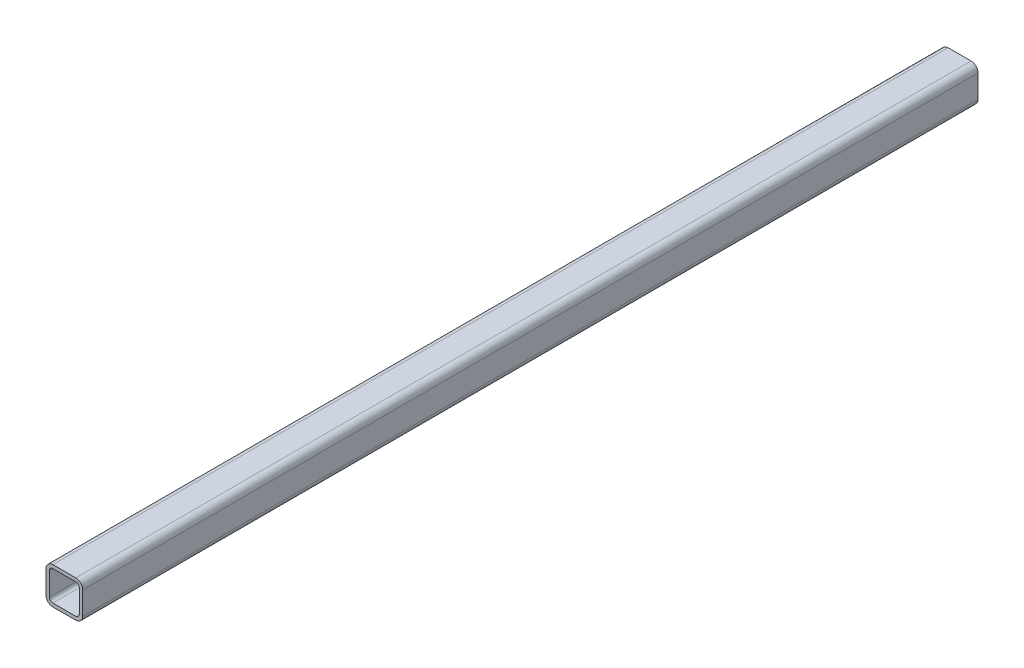
ISO-10303-21;
HEADER;
FILE_DESCRIPTION(('STEP AP214'),'2;1');
FILE_NAME('part.step','',(''),(''),'','','');
FILE_SCHEMA(('AUTOMOTIVE_DESIGN { 1 0 10303 214 1 1 1 1 }'));
ENDSEC;
DATA;
#1=APPLICATION_CONTEXT('core data for automotive mechanical design processes');
#2=APPLICATION_PROTOCOL_DEFINITION('international standard','automotive_design',2000,#1);
#3=PRODUCT_CONTEXT('',#1,'mechanical');
#4=PRODUCT('Part','Part','',(#3));
#5=PRODUCT_RELATED_PRODUCT_CATEGORY('part','',(#4));
#6=PRODUCT_DEFINITION_FORMATION('','',#4);
#7=PRODUCT_DEFINITION_CONTEXT('part definition',#1,'design');
#8=PRODUCT_DEFINITION('design','',#6,#7);
#9=PRODUCT_DEFINITION_SHAPE('','',#8);
#10=(LENGTH_UNIT() NAMED_UNIT(*) SI_UNIT(.MILLI.,.METRE.));
#11=(NAMED_UNIT(*) PLANE_ANGLE_UNIT() SI_UNIT($,.RADIAN.));
#12=(NAMED_UNIT(*) SI_UNIT($,.STERADIAN.) SOLID_ANGLE_UNIT());
#13=UNCERTAINTY_MEASURE_WITH_UNIT(LENGTH_MEASURE(1.E-05),#10,'distance_accuracy_value','');
#14=(GEOMETRIC_REPRESENTATION_CONTEXT(3) GLOBAL_UNCERTAINTY_ASSIGNED_CONTEXT((#13)) GLOBAL_UNIT_ASSIGNED_CONTEXT((#10,
#11,#12)) REPRESENTATION_CONTEXT('',''));
#15=CARTESIAN_POINT('',(0.,0.,0.));
#16=DIRECTION('',(0.,0.,1.));
#17=DIRECTION('',(1.,0.,0.));
#18=AXIS2_PLACEMENT_3D('',#15,#16,#17);
#19=CARTESIAN_POINT('',(41.27,41.27,1239.2));
#20=DIRECTION('',(0.,0.,-1.));
#21=DIRECTION('',(-1.,0.,0.));
#22=AXIS2_PLACEMENT_3D('',#19,#20,#21);
#23=PLANE('',#22);
#24=CARTESIAN_POINT('',(41.27,41.27,1239.2));
#25=DIRECTION('',(0.,0.,1.));
#26=DIRECTION('',(-1.,0.,0.));
#27=AXIS2_PLACEMENT_3D('',#24,#25,#26);
#28=CIRCLE('',#27,9.53);
#29=CARTESIAN_POINT('',(50.8,41.2699999999999,1239.2));
#30=VERTEX_POINT('',#29);
#31=CARTESIAN_POINT('',(41.2699999999999,50.8,1239.2));
#32=VERTEX_POINT('',#31);
#33=EDGE_CURVE('E246',#30,#32,#28,.T.);
#34=ORIENTED_EDGE('',*,*,#33,.T.);
#35=DIRECTION('',(-1.,0.,0.));
#36=VECTOR('',#35,1.);
#37=CARTESIAN_POINT('',(9.53000000000007,50.8,1239.2));
#38=LINE('',#37,#36);
#39=CARTESIAN_POINT('',(9.53000000000007,50.8,1239.2));
#40=VERTEX_POINT('',#39);
#41=EDGE_CURVE('E250',#32,#40,#38,.T.);
#42=ORIENTED_EDGE('',*,*,#41,.T.);
#43=CARTESIAN_POINT('',(9.53,41.27,1239.2));
#44=DIRECTION('',(0.,0.,1.));
#45=DIRECTION('',(-1.,0.,0.));
#46=AXIS2_PLACEMENT_3D('',#43,#44,#45);
#47=CIRCLE('',#46,9.53);
#48=CARTESIAN_POINT('',(0.,41.2699999999999,1239.2));
#49=VERTEX_POINT('',#48);
#50=EDGE_CURVE('E254',#40,#49,#47,.T.);
#51=ORIENTED_EDGE('',*,*,#50,.T.);
#52=DIRECTION('',(0.,-1.,0.));
#53=VECTOR('',#52,1.);
#54=CARTESIAN_POINT('',(0.,9.53000000000007,1239.2));
#55=LINE('',#54,#53);
#56=CARTESIAN_POINT('',(0.,9.53000000000007,1239.2));
#57=VERTEX_POINT('',#56);
#58=EDGE_CURVE('E257',#49,#57,#55,.T.);
#59=ORIENTED_EDGE('',*,*,#58,.T.);
#60=CARTESIAN_POINT('',(9.53,9.53,1239.2));
#61=DIRECTION('',(0.,0.,1.));
#62=DIRECTION('',(-1.,0.,0.));
#63=AXIS2_PLACEMENT_3D('',#60,#61,#62);
#64=CIRCLE('',#63,9.53);
#65=CARTESIAN_POINT('',(9.53000000000007,0.,1239.2));
#66=VERTEX_POINT('',#65);
#67=EDGE_CURVE('E260',#57,#66,#64,.T.);
#68=ORIENTED_EDGE('',*,*,#67,.T.);
#69=DIRECTION('',(1.,0.,0.));
#70=VECTOR('',#69,1.);
#71=CARTESIAN_POINT('',(9.53000000000007,0.,1239.2));
#72=LINE('',#71,#70);
#73=CARTESIAN_POINT('',(41.2699999999999,0.,1239.2));
#74=VERTEX_POINT('',#73);
#75=EDGE_CURVE('E263',#66,#74,#72,.T.);
#76=ORIENTED_EDGE('',*,*,#75,.T.);
#77=CARTESIAN_POINT('',(41.27,9.53,1239.2));
#78=DIRECTION('',(0.,0.,1.));
#79=DIRECTION('',(-1.,0.,0.));
#80=AXIS2_PLACEMENT_3D('',#77,#78,#79);
#81=CIRCLE('',#80,9.53);
#82=CARTESIAN_POINT('',(50.8,9.53000000000007,1239.2));
#83=VERTEX_POINT('',#82);
#84=EDGE_CURVE('E266',#74,#83,#81,.T.);
#85=ORIENTED_EDGE('',*,*,#84,.T.);
#86=DIRECTION('',(0.,1.,0.));
#87=VECTOR('',#86,1.);
#88=CARTESIAN_POINT('',(50.8,9.53000000000007,1239.2));
#89=LINE('',#88,#87);
#90=EDGE_CURVE('E269',#83,#30,#89,.T.);
#91=ORIENTED_EDGE('',*,*,#90,.T.);
#92=EDGE_LOOP('',(#34,#42,#51,#59,#68,#76,#85,#91));
#93=FACE_BOUND('',#92,.T.);
#94=CARTESIAN_POINT('',(9.52,9.52,1239.2));
#95=DIRECTION('',(0.,0.,1.));
#96=DIRECTION('',(1.,0.,0.));
#97=AXIS2_PLACEMENT_3D('',#94,#95,#96);
#98=CIRCLE('',#97,4.76);
#99=CARTESIAN_POINT('',(4.76,9.52000000000003,1239.2));
#100=VERTEX_POINT('',#99);
#101=CARTESIAN_POINT('',(9.52000000000004,4.76,1239.2));
#102=VERTEX_POINT('',#101);
#103=EDGE_CURVE('E157',#100,#102,#98,.T.);
#104=ORIENTED_EDGE('',*,*,#103,.F.);
#105=DIRECTION('',(0.,-1.,0.));
#106=VECTOR('',#105,1.);
#107=CARTESIAN_POINT('',(4.76,41.28,1239.2));
#108=LINE('',#107,#106);
#109=CARTESIAN_POINT('',(4.76,41.28,1239.2));
#110=VERTEX_POINT('',#109);
#111=EDGE_CURVE('E198',#110,#100,#108,.T.);
#112=ORIENTED_EDGE('',*,*,#111,.F.);
#113=CARTESIAN_POINT('',(9.52,41.28,1239.2));
#114=DIRECTION('',(0.,0.,1.));
#115=DIRECTION('',(-1.,0.,0.));
#116=AXIS2_PLACEMENT_3D('',#113,#114,#115);
#117=CIRCLE('',#116,4.76);
#118=CARTESIAN_POINT('',(9.52000000000003,46.04,1239.2));
#119=VERTEX_POINT('',#118);
#120=EDGE_CURVE('E195',#119,#110,#117,.T.);
#121=ORIENTED_EDGE('',*,*,#120,.F.);
#122=DIRECTION('',(-1.,0.,0.));
#123=VECTOR('',#122,1.);
#124=CARTESIAN_POINT('',(9.52000000000003,46.04,1239.2));
#125=LINE('',#124,#123);
#126=CARTESIAN_POINT('',(41.28,46.04,1239.2));
#127=VERTEX_POINT('',#126);
#128=EDGE_CURVE('E192',#127,#119,#125,.T.);
#129=ORIENTED_EDGE('',*,*,#128,.F.);
#130=CARTESIAN_POINT('',(41.28,41.28,1239.2));
#131=DIRECTION('',(0.,0.,1.));
#132=DIRECTION('',(1.,0.,0.));
#133=AXIS2_PLACEMENT_3D('',#130,#131,#132);
#134=CIRCLE('',#133,4.76);
#135=CARTESIAN_POINT('',(46.04,41.28,1239.2));
#136=VERTEX_POINT('',#135);
#137=EDGE_CURVE('E189',#136,#127,#134,.T.);
#138=ORIENTED_EDGE('',*,*,#137,.F.);
#139=DIRECTION('',(0.,1.,0.));
#140=VECTOR('',#139,1.);
#141=CARTESIAN_POINT('',(46.04,41.28,1239.2));
#142=LINE('',#141,#140);
#143=CARTESIAN_POINT('',(46.04,9.52000000000003,1239.2));
#144=VERTEX_POINT('',#143);
#145=EDGE_CURVE('E184',#144,#136,#142,.T.);
#146=ORIENTED_EDGE('',*,*,#145,.F.);
#147=CARTESIAN_POINT('',(41.28,9.52,1239.2));
#148=DIRECTION('',(0.,0.,1.));
#149=DIRECTION('',(1.,0.,0.));
#150=AXIS2_PLACEMENT_3D('',#147,#148,#149);
#151=CIRCLE('',#150,4.76);
#152=CARTESIAN_POINT('',(41.28,4.76,1239.2));
#153=VERTEX_POINT('',#152);
#154=EDGE_CURVE('E180',#153,#144,#151,.T.);
#155=ORIENTED_EDGE('',*,*,#154,.F.);
#156=DIRECTION('',(1.,0.,0.));
#157=VECTOR('',#156,1.);
#158=CARTESIAN_POINT('',(9.52000000000004,4.76,1239.2));
#159=LINE('',#158,#157);
#160=EDGE_CURVE('E166',#102,#153,#159,.T.);
#161=ORIENTED_EDGE('',*,*,#160,.F.);
#162=EDGE_LOOP('',(#104,#112,#121,#129,#138,#146,#155,#161));
#163=FACE_BOUND('',#162,.T.);
#164=ADVANCED_FACE('F43',(#93,#163),#23,.F.);
#165=CARTESIAN_POINT('',(41.27,41.27,0.));
#166=DIRECTION('',(0.,0.,-1.));
#167=DIRECTION('',(-1.,0.,0.));
#168=AXIS2_PLACEMENT_3D('',#165,#166,#167);
#169=PLANE('',#168);
#170=CARTESIAN_POINT('',(41.27,41.27,0.));
#171=DIRECTION('',(0.,0.,1.));
#172=DIRECTION('',(-1.,0.,0.));
#173=AXIS2_PLACEMENT_3D('',#170,#171,#172);
#174=CIRCLE('',#173,9.53);
#175=CARTESIAN_POINT('',(50.8,41.2699999999999,0.));
#176=VERTEX_POINT('',#175);
#177=CARTESIAN_POINT('',(41.2699999999999,50.8,0.));
#178=VERTEX_POINT('',#177);
#179=EDGE_CURVE('E175',#176,#178,#174,.T.);
#180=ORIENTED_EDGE('',*,*,#179,.F.);
#181=DIRECTION('',(0.,1.,0.));
#182=VECTOR('',#181,1.);
#183=CARTESIAN_POINT('',(50.8,9.53000000000007,0.));
#184=LINE('',#183,#182);
#185=CARTESIAN_POINT('',(50.8,9.53000000000007,0.));
#186=VERTEX_POINT('',#185);
#187=EDGE_CURVE('E251',#186,#176,#184,.T.);
#188=ORIENTED_EDGE('',*,*,#187,.F.);
#189=CARTESIAN_POINT('',(41.27,9.53,0.));
#190=DIRECTION('',(0.,0.,1.));
#191=DIRECTION('',(-1.,0.,0.));
#192=AXIS2_PLACEMENT_3D('',#189,#190,#191);
#193=CIRCLE('',#192,9.53);
#194=CARTESIAN_POINT('',(41.2699999999999,0.,0.));
#195=VERTEX_POINT('',#194);
#196=EDGE_CURVE('E291',#195,#186,#193,.T.);
#197=ORIENTED_EDGE('',*,*,#196,.F.);
#198=DIRECTION('',(1.,0.,0.));
#199=VECTOR('',#198,1.);
#200=CARTESIAN_POINT('',(9.53000000000007,0.,0.));
#201=LINE('',#200,#199);
#202=CARTESIAN_POINT('',(9.53000000000007,0.,0.));
#203=VERTEX_POINT('',#202);
#204=EDGE_CURVE('E288',#203,#195,#201,.T.);
#205=ORIENTED_EDGE('',*,*,#204,.F.);
#206=CARTESIAN_POINT('',(9.53,9.53,0.));
#207=DIRECTION('',(0.,0.,1.));
#208=DIRECTION('',(-1.,0.,0.));
#209=AXIS2_PLACEMENT_3D('',#206,#207,#208);
#210=CIRCLE('',#209,9.53);
#211=CARTESIAN_POINT('',(0.,9.53000000000007,0.));
#212=VERTEX_POINT('',#211);
#213=EDGE_CURVE('E285',#212,#203,#210,.T.);
#214=ORIENTED_EDGE('',*,*,#213,.F.);
#215=DIRECTION('',(0.,-1.,0.));
#216=VECTOR('',#215,1.);
#217=CARTESIAN_POINT('',(0.,9.53000000000007,0.));
#218=LINE('',#217,#216);
#219=CARTESIAN_POINT('',(0.,41.2699999999999,0.));
#220=VERTEX_POINT('',#219);
#221=EDGE_CURVE('E282',#220,#212,#218,.T.);
#222=ORIENTED_EDGE('',*,*,#221,.F.);
#223=CARTESIAN_POINT('',(9.53,41.27,0.));
#224=DIRECTION('',(0.,0.,1.));
#225=DIRECTION('',(-1.,0.,0.));
#226=AXIS2_PLACEMENT_3D('',#223,#224,#225);
#227=CIRCLE('',#226,9.53);
#228=CARTESIAN_POINT('',(9.53000000000007,50.8,0.));
#229=VERTEX_POINT('',#228);
#230=EDGE_CURVE('E279',#229,#220,#227,.T.);
#231=ORIENTED_EDGE('',*,*,#230,.F.);
#232=DIRECTION('',(-1.,0.,0.));
#233=VECTOR('',#232,1.);
#234=CARTESIAN_POINT('',(9.53000000000007,50.8,0.));
#235=LINE('',#234,#233);
#236=EDGE_CURVE('E276',#178,#229,#235,.T.);
#237=ORIENTED_EDGE('',*,*,#236,.F.);
#238=EDGE_LOOP('',(#180,#188,#197,#205,#214,#222,#231,#237));
#239=FACE_BOUND('',#238,.T.);
#240=DIRECTION('',(0.,-1.,0.));
#241=VECTOR('',#240,1.);
#242=CARTESIAN_POINT('',(4.76,41.28,0.));
#243=LINE('',#242,#241);
#244=CARTESIAN_POINT('',(4.76,41.28,0.));
#245=VERTEX_POINT('',#244);
#246=CARTESIAN_POINT('',(4.76,9.52000000000004,0.));
#247=VERTEX_POINT('',#246);
#248=EDGE_CURVE('E167',#245,#247,#243,.T.);
#249=ORIENTED_EDGE('',*,*,#248,.T.);
#250=CARTESIAN_POINT('',(9.52,9.52,0.));
#251=DIRECTION('',(0.,0.,1.));
#252=DIRECTION('',(1.,0.,0.));
#253=AXIS2_PLACEMENT_3D('',#250,#251,#252);
#254=CIRCLE('',#253,4.76);
#255=CARTESIAN_POINT('',(9.52000000000004,4.76,0.));
#256=VERTEX_POINT('',#255);
#257=EDGE_CURVE('E67',#247,#256,#254,.T.);
#258=ORIENTED_EDGE('',*,*,#257,.T.);
#259=DIRECTION('',(1.,0.,0.));
#260=VECTOR('',#259,1.);
#261=CARTESIAN_POINT('',(9.52000000000004,4.76,0.));
#262=LINE('',#261,#260);
#263=CARTESIAN_POINT('',(41.28,4.76,0.));
#264=VERTEX_POINT('',#263);
#265=EDGE_CURVE('E173',#256,#264,#262,.T.);
#266=ORIENTED_EDGE('',*,*,#265,.T.);
#267=CARTESIAN_POINT('',(41.28,9.52,0.));
#268=DIRECTION('',(0.,0.,1.));
#269=DIRECTION('',(1.,0.,0.));
#270=AXIS2_PLACEMENT_3D('',#267,#268,#269);
#271=CIRCLE('',#270,4.76);
#272=CARTESIAN_POINT('',(46.04,9.52000000000003,0.));
#273=VERTEX_POINT('',#272);
#274=EDGE_CURVE('E205',#264,#273,#271,.T.);
#275=ORIENTED_EDGE('',*,*,#274,.T.);
#276=DIRECTION('',(0.,1.,0.));
#277=VECTOR('',#276,1.);
#278=CARTESIAN_POINT('',(46.04,41.28,0.));
#279=LINE('',#278,#277);
#280=CARTESIAN_POINT('',(46.04,41.28,0.));
#281=VERTEX_POINT('',#280);
#282=EDGE_CURVE('E209',#273,#281,#279,.T.);
#283=ORIENTED_EDGE('',*,*,#282,.T.);
#284=CARTESIAN_POINT('',(41.28,41.28,0.));
#285=DIRECTION('',(0.,0.,1.));
#286=DIRECTION('',(1.,0.,0.));
#287=AXIS2_PLACEMENT_3D('',#284,#285,#286);
#288=CIRCLE('',#287,4.76);
#289=CARTESIAN_POINT('',(41.28,46.04,0.));
#290=VERTEX_POINT('',#289);
#291=EDGE_CURVE('E213',#281,#290,#288,.T.);
#292=ORIENTED_EDGE('',*,*,#291,.T.);
#293=DIRECTION('',(-1.,0.,0.));
#294=VECTOR('',#293,1.);
#295=CARTESIAN_POINT('',(9.52000000000003,46.04,0.));
#296=LINE('',#295,#294);
#297=CARTESIAN_POINT('',(9.52000000000003,46.04,0.));
#298=VERTEX_POINT('',#297);
#299=EDGE_CURVE('E217',#290,#298,#296,.T.);
#300=ORIENTED_EDGE('',*,*,#299,.T.);
#301=CARTESIAN_POINT('',(9.52,41.28,0.));
#302=DIRECTION('',(0.,0.,1.));
#303=DIRECTION('',(-1.,0.,0.));
#304=AXIS2_PLACEMENT_3D('',#301,#302,#303);
#305=CIRCLE('',#304,4.76);
#306=EDGE_CURVE('E221',#298,#245,#305,.T.);
#307=ORIENTED_EDGE('',*,*,#306,.T.);
#308=EDGE_LOOP('',(#249,#258,#266,#275,#283,#292,#300,#307));
#309=FACE_BOUND('',#308,.T.);
#310=ADVANCED_FACE('F330',(#239,#309),#169,.T.);
#311=CARTESIAN_POINT('',(41.27,41.27,1239.2));
#312=DIRECTION('',(0.,0.,-1.));
#313=DIRECTION('',(-1.,0.,0.));
#314=AXIS2_PLACEMENT_3D('',#311,#312,#313);
#315=CYLINDRICAL_SURFACE('',#314,9.53);
#316=ORIENTED_EDGE('',*,*,#179,.T.);
#317=DIRECTION('',(0.,0.,-1.));
#318=VECTOR('',#317,1.);
#319=CARTESIAN_POINT('',(41.2699999999999,50.8,1239.2));
#320=LINE('',#319,#318);
#321=EDGE_CURVE('E11',#32,#178,#320,.T.);
#322=ORIENTED_EDGE('',*,*,#321,.F.);
#323=ORIENTED_EDGE('',*,*,#33,.F.);
#324=DIRECTION('',(0.,0.,-1.));
#325=VECTOR('',#324,1.);
#326=CARTESIAN_POINT('',(50.8,41.2699999999999,1239.2));
#327=LINE('',#326,#325);
#328=EDGE_CURVE('E272',#30,#176,#327,.T.);
#329=ORIENTED_EDGE('',*,*,#328,.T.);
#330=EDGE_LOOP('',(#316,#322,#323,#329));
#331=FACE_BOUND('',#330,.T.);
#332=ADVANCED_FACE('F45',(#331),#315,.T.);
#333=CARTESIAN_POINT('',(9.53000000000007,50.8,1239.2));
#334=DIRECTION('',(0.,-1.,0.));
#335=DIRECTION('',(0.,0.,-1.));
#336=AXIS2_PLACEMENT_3D('',#333,#334,#335);
#337=PLANE('',#336);
#338=ORIENTED_EDGE('',*,*,#236,.T.);
#339=DIRECTION('',(0.,0.,-1.));
#340=VECTOR('',#339,1.);
#341=CARTESIAN_POINT('',(9.53000000000007,50.8,1239.2));
#342=LINE('',#341,#340);
#343=EDGE_CURVE('E52',#40,#229,#342,.T.);
#344=ORIENTED_EDGE('',*,*,#343,.F.);
#345=ORIENTED_EDGE('',*,*,#41,.F.);
#346=ORIENTED_EDGE('',*,*,#321,.T.);
#347=EDGE_LOOP('',(#338,#344,#345,#346));
#348=FACE_BOUND('',#347,.T.);
#349=ADVANCED_FACE('F347',(#348),#337,.F.);
#350=CARTESIAN_POINT('',(9.53,41.27,1239.2));
#351=DIRECTION('',(0.,0.,-1.));
#352=DIRECTION('',(-1.,0.,0.));
#353=AXIS2_PLACEMENT_3D('',#350,#351,#352);
#354=CYLINDRICAL_SURFACE('',#353,9.53);
#355=ORIENTED_EDGE('',*,*,#230,.T.);
#356=DIRECTION('',(0.,0.,-1.));
#357=VECTOR('',#356,1.);
#358=CARTESIAN_POINT('',(0.,41.2699999999999,1239.2));
#359=LINE('',#358,#357);
#360=EDGE_CURVE('E315',#49,#220,#359,.T.);
#361=ORIENTED_EDGE('',*,*,#360,.F.);
#362=ORIENTED_EDGE('',*,*,#50,.F.);
#363=ORIENTED_EDGE('',*,*,#343,.T.);
#364=EDGE_LOOP('',(#355,#361,#362,#363));
#365=FACE_BOUND('',#364,.T.);
#366=ADVANCED_FACE('F324',(#365),#354,.T.);
#367=CARTESIAN_POINT('',(0.,9.53000000000007,1239.2));
#368=DIRECTION('',(1.,0.,0.));
#369=DIRECTION('',(0.,0.,-1.));
#370=AXIS2_PLACEMENT_3D('',#367,#368,#369);
#371=PLANE('',#370);
#372=ORIENTED_EDGE('',*,*,#221,.T.);
#373=DIRECTION('',(0.,0.,-1.));
#374=VECTOR('',#373,1.);
#375=CARTESIAN_POINT('',(0.,9.53000000000007,1239.2));
#376=LINE('',#375,#374);
#377=EDGE_CURVE('E311',#57,#212,#376,.T.);
#378=ORIENTED_EDGE('',*,*,#377,.F.);
#379=ORIENTED_EDGE('',*,*,#58,.F.);
#380=ORIENTED_EDGE('',*,*,#360,.T.);
#381=EDGE_LOOP('',(#372,#378,#379,#380));
#382=FACE_BOUND('',#381,.T.);
#383=ADVANCED_FACE('F336',(#382),#371,.F.);
#384=CARTESIAN_POINT('',(9.53,9.53,1239.2));
#385=DIRECTION('',(0.,0.,-1.));
#386=DIRECTION('',(-1.,0.,0.));
#387=AXIS2_PLACEMENT_3D('',#384,#385,#386);
#388=CYLINDRICAL_SURFACE('',#387,9.53);
#389=ORIENTED_EDGE('',*,*,#213,.T.);
#390=DIRECTION('',(0.,0.,-1.));
#391=VECTOR('',#390,1.);
#392=CARTESIAN_POINT('',(9.53000000000007,0.,1239.2));
#393=LINE('',#392,#391);
#394=EDGE_CURVE('E307',#66,#203,#393,.T.);
#395=ORIENTED_EDGE('',*,*,#394,.F.);
#396=ORIENTED_EDGE('',*,*,#67,.F.);
#397=ORIENTED_EDGE('',*,*,#377,.T.);
#398=EDGE_LOOP('',(#389,#395,#396,#397));
#399=FACE_BOUND('',#398,.T.);
#400=ADVANCED_FACE('F340',(#399),#388,.T.);
#401=CARTESIAN_POINT('',(9.53000000000007,0.,1239.2));
#402=DIRECTION('',(0.,1.,0.));
#403=DIRECTION('',(0.,0.,1.));
#404=AXIS2_PLACEMENT_3D('',#401,#402,#403);
#405=PLANE('',#404);
#406=ORIENTED_EDGE('',*,*,#204,.T.);
#407=DIRECTION('',(0.,0.,-1.));
#408=VECTOR('',#407,1.);
#409=CARTESIAN_POINT('',(41.2699999999999,0.,1239.2));
#410=LINE('',#409,#408);
#411=EDGE_CURVE('E303',#74,#195,#410,.T.);
#412=ORIENTED_EDGE('',*,*,#411,.F.);
#413=ORIENTED_EDGE('',*,*,#75,.F.);
#414=ORIENTED_EDGE('',*,*,#394,.T.);
#415=EDGE_LOOP('',(#406,#412,#413,#414));
#416=FACE_BOUND('',#415,.T.);
#417=ADVANCED_FACE('F360',(#416),#405,.F.);
#418=CARTESIAN_POINT('',(41.27,9.53,1239.2));
#419=DIRECTION('',(0.,0.,-1.));
#420=DIRECTION('',(-1.,0.,0.));
#421=AXIS2_PLACEMENT_3D('',#418,#419,#420);
#422=CYLINDRICAL_SURFACE('',#421,9.53);
#423=ORIENTED_EDGE('',*,*,#196,.T.);
#424=DIRECTION('',(0.,0.,-1.));
#425=VECTOR('',#424,1.);
#426=CARTESIAN_POINT('',(50.8,9.53000000000007,1239.2));
#427=LINE('',#426,#425);
#428=EDGE_CURVE('E299',#83,#186,#427,.T.);
#429=ORIENTED_EDGE('',*,*,#428,.F.);
#430=ORIENTED_EDGE('',*,*,#84,.F.);
#431=ORIENTED_EDGE('',*,*,#411,.T.);
#432=EDGE_LOOP('',(#423,#429,#430,#431));
#433=FACE_BOUND('',#432,.T.);
#434=ADVANCED_FACE('F358',(#433),#422,.T.);
#435=CARTESIAN_POINT('',(50.8,9.53000000000007,1239.2));
#436=DIRECTION('',(-1.,0.,0.));
#437=DIRECTION('',(0.,0.,1.));
#438=AXIS2_PLACEMENT_3D('',#435,#436,#437);
#439=PLANE('',#438);
#440=ORIENTED_EDGE('',*,*,#187,.T.);
#441=ORIENTED_EDGE('',*,*,#328,.F.);
#442=ORIENTED_EDGE('',*,*,#90,.F.);
#443=ORIENTED_EDGE('',*,*,#428,.T.);
#444=EDGE_LOOP('',(#440,#441,#442,#443));
#445=FACE_BOUND('',#444,.T.);
#446=ADVANCED_FACE('F353',(#445),#439,.F.);
#447=CARTESIAN_POINT('',(9.52,9.52,1239.2));
#448=DIRECTION('',(0.,0.,-1.));
#449=DIRECTION('',(-1.,0.,0.));
#450=AXIS2_PLACEMENT_3D('',#447,#448,#449);
#451=CYLINDRICAL_SURFACE('',#450,4.76);
#452=ORIENTED_EDGE('',*,*,#257,.F.);
#453=DIRECTION('',(0.,0.,-1.));
#454=VECTOR('',#453,1.);
#455=CARTESIAN_POINT('',(4.76,9.52000000000003,1239.2));
#456=LINE('',#455,#454);
#457=EDGE_CURVE('E161',#100,#247,#456,.T.);
#458=ORIENTED_EDGE('',*,*,#457,.F.);
#459=ORIENTED_EDGE('',*,*,#103,.T.);
#460=DIRECTION('',(0.,0.,-1.));
#461=VECTOR('',#460,1.);
#462=CARTESIAN_POINT('',(9.52000000000004,4.76,1239.2));
#463=LINE('',#462,#461);
#464=EDGE_CURVE('E160',#102,#256,#463,.T.);
#465=ORIENTED_EDGE('',*,*,#464,.T.);
#466=EDGE_LOOP('',(#452,#458,#459,#465));
#467=FACE_BOUND('',#466,.T.);
#468=ADVANCED_FACE('F159',(#467),#451,.F.);
#469=CARTESIAN_POINT('',(9.52000000000004,4.76,1239.2));
#470=DIRECTION('',(0.,1.,0.));
#471=DIRECTION('',(-1.,0.,0.));
#472=AXIS2_PLACEMENT_3D('',#469,#470,#471);
#473=PLANE('',#472);
#474=ORIENTED_EDGE('',*,*,#265,.F.);
#475=ORIENTED_EDGE('',*,*,#464,.F.);
#476=ORIENTED_EDGE('',*,*,#160,.T.);
#477=DIRECTION('',(0.,0.,-1.));
#478=VECTOR('',#477,1.);
#479=CARTESIAN_POINT('',(41.28,4.76,1239.2));
#480=LINE('',#479,#478);
#481=EDGE_CURVE('E176',#153,#264,#480,.T.);
#482=ORIENTED_EDGE('',*,*,#481,.T.);
#483=EDGE_LOOP('',(#474,#475,#476,#482));
#484=FACE_BOUND('',#483,.T.);
#485=ADVANCED_FACE('F170',(#484),#473,.T.);
#486=CARTESIAN_POINT('',(41.28,9.52,1239.2));
#487=DIRECTION('',(0.,0.,-1.));
#488=DIRECTION('',(-1.,0.,0.));
#489=AXIS2_PLACEMENT_3D('',#486,#487,#488);
#490=CYLINDRICAL_SURFACE('',#489,4.76);
#491=ORIENTED_EDGE('',*,*,#274,.F.);
#492=ORIENTED_EDGE('',*,*,#481,.F.);
#493=ORIENTED_EDGE('',*,*,#154,.T.);
#494=DIRECTION('',(0.,0.,-1.));
#495=VECTOR('',#494,1.);
#496=CARTESIAN_POINT('',(46.04,9.52000000000003,1239.2));
#497=LINE('',#496,#495);
#498=EDGE_CURVE('E241',#144,#273,#497,.T.);
#499=ORIENTED_EDGE('',*,*,#498,.T.);
#500=EDGE_LOOP('',(#491,#492,#493,#499));
#501=FACE_BOUND('',#500,.T.);
#502=ADVANCED_FACE('F385',(#501),#490,.F.);
#503=CARTESIAN_POINT('',(46.04,41.28,1239.2));
#504=DIRECTION('',(-1.,0.,0.));
#505=DIRECTION('',(0.,-1.,0.));
#506=AXIS2_PLACEMENT_3D('',#503,#504,#505);
#507=PLANE('',#506);
#508=ORIENTED_EDGE('',*,*,#282,.F.);
#509=ORIENTED_EDGE('',*,*,#498,.F.);
#510=ORIENTED_EDGE('',*,*,#145,.T.);
#511=DIRECTION('',(0.,0.,-1.));
#512=VECTOR('',#511,1.);
#513=CARTESIAN_POINT('',(46.04,41.28,1239.2));
#514=LINE('',#513,#512);
#515=EDGE_CURVE('E238',#136,#281,#514,.T.);
#516=ORIENTED_EDGE('',*,*,#515,.T.);
#517=EDGE_LOOP('',(#508,#509,#510,#516));
#518=FACE_BOUND('',#517,.T.);
#519=ADVANCED_FACE('F389',(#518),#507,.T.);
#520=CARTESIAN_POINT('',(41.28,41.28,1239.2));
#521=DIRECTION('',(0.,0.,-1.));
#522=DIRECTION('',(-1.,0.,0.));
#523=AXIS2_PLACEMENT_3D('',#520,#521,#522);
#524=CYLINDRICAL_SURFACE('',#523,4.76);
#525=ORIENTED_EDGE('',*,*,#291,.F.);
#526=ORIENTED_EDGE('',*,*,#515,.F.);
#527=ORIENTED_EDGE('',*,*,#137,.T.);
#528=DIRECTION('',(0.,0.,-1.));
#529=VECTOR('',#528,1.);
#530=CARTESIAN_POINT('',(41.28,46.04,1239.2));
#531=LINE('',#530,#529);
#532=EDGE_CURVE('E235',#127,#290,#531,.T.);
#533=ORIENTED_EDGE('',*,*,#532,.T.);
#534=EDGE_LOOP('',(#525,#526,#527,#533));
#535=FACE_BOUND('',#534,.T.);
#536=ADVANCED_FACE('F395',(#535),#524,.F.);
#537=CARTESIAN_POINT('',(9.52000000000003,46.04,1239.2));
#538=DIRECTION('',(0.,-1.,0.));
#539=DIRECTION('',(0.,0.,-1.));
#540=AXIS2_PLACEMENT_3D('',#537,#538,#539);
#541=PLANE('',#540);
#542=ORIENTED_EDGE('',*,*,#299,.F.);
#543=ORIENTED_EDGE('',*,*,#532,.F.);
#544=ORIENTED_EDGE('',*,*,#128,.T.);
#545=DIRECTION('',(0.,0.,-1.));
#546=VECTOR('',#545,1.);
#547=CARTESIAN_POINT('',(9.52000000000003,46.04,1239.2));
#548=LINE('',#547,#546);
#549=EDGE_CURVE('E232',#119,#298,#548,.T.);
#550=ORIENTED_EDGE('',*,*,#549,.T.);
#551=EDGE_LOOP('',(#542,#543,#544,#550));
#552=FACE_BOUND('',#551,.T.);
#553=ADVANCED_FACE('F399',(#552),#541,.T.);
#554=CARTESIAN_POINT('',(9.52,41.28,1239.2));
#555=DIRECTION('',(0.,0.,-1.));
#556=DIRECTION('',(-1.,0.,0.));
#557=AXIS2_PLACEMENT_3D('',#554,#555,#556);
#558=CYLINDRICAL_SURFACE('',#557,4.76);
#559=ORIENTED_EDGE('',*,*,#306,.F.);
#560=ORIENTED_EDGE('',*,*,#549,.F.);
#561=ORIENTED_EDGE('',*,*,#120,.T.);
#562=DIRECTION('',(0.,0.,-1.));
#563=VECTOR('',#562,1.);
#564=CARTESIAN_POINT('',(4.76,41.28,1239.2));
#565=LINE('',#564,#563);
#566=EDGE_CURVE('E59',#110,#245,#565,.T.);
#567=ORIENTED_EDGE('',*,*,#566,.T.);
#568=EDGE_LOOP('',(#559,#560,#561,#567));
#569=FACE_BOUND('',#568,.T.);
#570=ADVANCED_FACE('F403',(#569),#558,.F.);
#571=CARTESIAN_POINT('',(4.76,41.28,1239.2));
#572=DIRECTION('',(1.,0.,0.));
#573=DIRECTION('',(0.,1.,0.));
#574=AXIS2_PLACEMENT_3D('',#571,#572,#573);
#575=PLANE('',#574);
#576=ORIENTED_EDGE('',*,*,#248,.F.);
#577=ORIENTED_EDGE('',*,*,#566,.F.);
#578=ORIENTED_EDGE('',*,*,#111,.T.);
#579=ORIENTED_EDGE('',*,*,#457,.T.);
#580=EDGE_LOOP('',(#576,#577,#578,#579));
#581=FACE_BOUND('',#580,.T.);
#582=ADVANCED_FACE('F407',(#581),#575,.T.);
#583=CLOSED_SHELL('',(#164,#310,#332,#349,#366,#383,#400,#417,#434,#446,#468,#485,#502,#519,
#536,#553,#570,#582));
#584=MANIFOLD_SOLID_BREP('B2',#583);
#585=ADVANCED_BREP_SHAPE_REPRESENTATION('',(#18,#584),#14);
#586=SHAPE_DEFINITION_REPRESENTATION(#9,#585);
ENDSEC;
END-ISO-10303-21;
